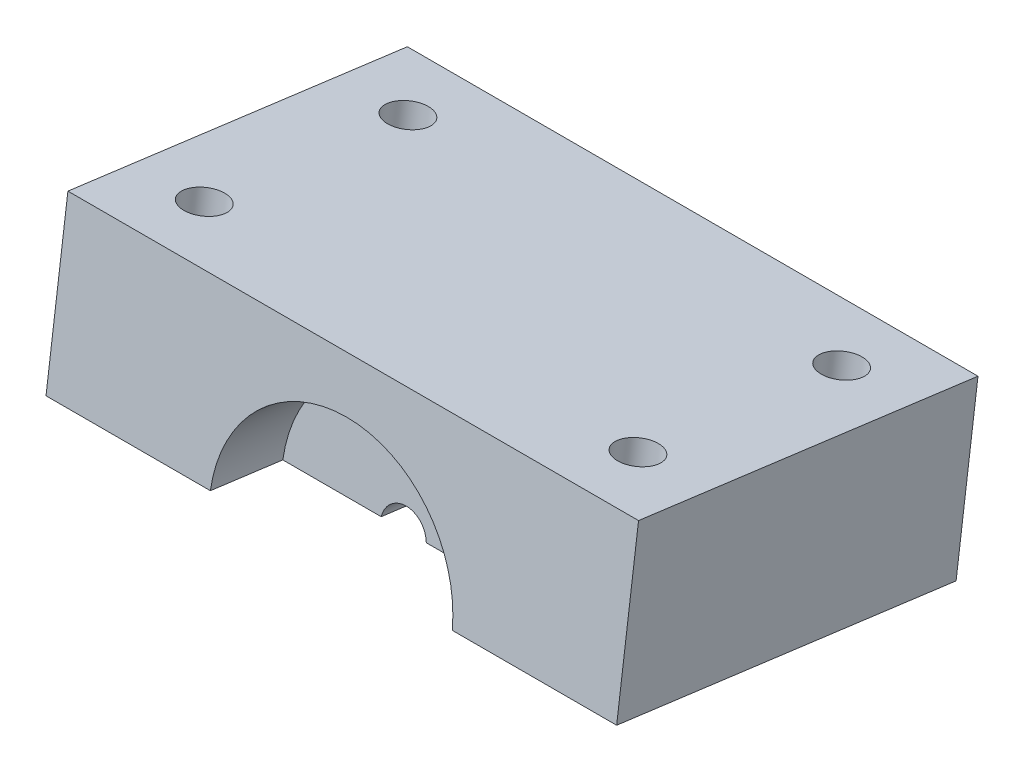
ISO-10303-21;
HEADER;
FILE_DESCRIPTION(('STEP AP214'),'2;1');
FILE_NAME('part.step','',(''),(''),'','','');
FILE_SCHEMA(('AUTOMOTIVE_DESIGN { 1 0 10303 214 1 1 1 1 }'));
ENDSEC;
DATA;
#1=APPLICATION_CONTEXT('core data for automotive mechanical design processes');
#2=APPLICATION_PROTOCOL_DEFINITION('international standard','automotive_design',2000,#1);
#3=PRODUCT_CONTEXT('',#1,'mechanical');
#4=PRODUCT('Part','Part','',(#3));
#5=PRODUCT_RELATED_PRODUCT_CATEGORY('part','',(#4));
#6=PRODUCT_DEFINITION_FORMATION('','',#4);
#7=PRODUCT_DEFINITION_CONTEXT('part definition',#1,'design');
#8=PRODUCT_DEFINITION('design','',#6,#7);
#9=PRODUCT_DEFINITION_SHAPE('','',#8);
#10=(LENGTH_UNIT() NAMED_UNIT(*) SI_UNIT(.MILLI.,.METRE.));
#11=(NAMED_UNIT(*) PLANE_ANGLE_UNIT() SI_UNIT($,.RADIAN.));
#12=(NAMED_UNIT(*) SI_UNIT($,.STERADIAN.) SOLID_ANGLE_UNIT());
#13=UNCERTAINTY_MEASURE_WITH_UNIT(LENGTH_MEASURE(1.E-05),#10,'distance_accuracy_value','');
#14=(GEOMETRIC_REPRESENTATION_CONTEXT(3) GLOBAL_UNCERTAINTY_ASSIGNED_CONTEXT((#13)) GLOBAL_UNIT_ASSIGNED_CONTEXT((#10,
#11,#12)) REPRESENTATION_CONTEXT('',''));
#15=CARTESIAN_POINT('',(0.,0.,0.));
#16=DIRECTION('',(0.,0.,1.));
#17=DIRECTION('',(1.,0.,0.));
#18=AXIS2_PLACEMENT_3D('',#15,#16,#17);
#19=CARTESIAN_POINT('',(-47.5,-10.8369896982407,-13.7027176486001));
#20=DIRECTION('',(0.,0.991444861373812,-0.130526192220038));
#21=DIRECTION('',(0.,0.130526192220039,0.991444861373812));
#22=AXIS2_PLACEMENT_3D('',#19,#20,#21);
#23=CYLINDRICAL_SURFACE('',#22,2.75);
#24=CARTESIAN_POINT('',(-47.5,-1.21430923727022,-14.9695675647722));
#25=DIRECTION('',(0.,-0.991444861373812,0.130526192220038));
#26=DIRECTION('',(0.,-0.130526192220038,-0.991444861373812));
#27=AXIS2_PLACEMENT_3D('',#24,#25,#26);
#28=CIRCLE('',#27,2.75);
#29=CARTESIAN_POINT('',(-47.5,-1.57325626587533,-17.6960409335502));
#30=VERTEX_POINT('',#29);
#31=EDGE_CURVE('E147',#30,#30,#28,.T.);
#32=ORIENTED_EDGE('',*,*,#31,.T.);
#33=EDGE_LOOP('',(#32));
#34=FACE_BOUND('',#33,.T.);
#35=CARTESIAN_POINT('',(-47.5,29.2726202499745,-18.9832479755384));
#36=DIRECTION('',(0.,0.991444861373812,-0.130526192220038));
#37=DIRECTION('',(0.,0.130526192220038,0.991444861373812));
#38=AXIS2_PLACEMENT_3D('',#35,#36,#37);
#39=CIRCLE('',#38,2.75);
#40=CARTESIAN_POINT('',(-47.5,29.6315672785796,-16.2567746067604));
#41=VERTEX_POINT('',#40);
#42=EDGE_CURVE('E41',#41,#41,#39,.F.);
#43=ORIENTED_EDGE('',*,*,#42,.F.);
#44=EDGE_LOOP('',(#43));
#45=FACE_BOUND('',#44,.T.);
#46=ADVANCED_FACE('F37',(#34,#45),#23,.F.);
#47=CARTESIAN_POINT('',(-47.5,-16.7106683481424,-58.3177364104217));
#48=DIRECTION('',(0.,0.991444861373812,-0.130526192220038));
#49=DIRECTION('',(0.,0.130526192220039,0.991444861373812));
#50=AXIS2_PLACEMENT_3D('',#47,#48,#49);
#51=CYLINDRICAL_SURFACE('',#50,2.75);
#52=CARTESIAN_POINT('',(-47.5,-7.08798788717195,-59.5845863265937));
#53=DIRECTION('',(0.,-0.991444861373812,0.130526192220038));
#54=DIRECTION('',(0.,-0.130526192220038,-0.991444861373812));
#55=AXIS2_PLACEMENT_3D('',#52,#53,#54);
#56=CIRCLE('',#55,2.75);
#57=CARTESIAN_POINT('',(-47.5,-7.44693491577706,-62.3110596953717));
#58=VERTEX_POINT('',#57);
#59=EDGE_CURVE('E151',#58,#58,#56,.T.);
#60=ORIENTED_EDGE('',*,*,#59,.T.);
#61=EDGE_LOOP('',(#60));
#62=FACE_BOUND('',#61,.T.);
#63=CARTESIAN_POINT('',(-47.5,23.3989416000728,-63.5982667373599));
#64=DIRECTION('',(0.,0.991444861373812,-0.130526192220038));
#65=DIRECTION('',(0.,0.130526192220038,0.991444861373812));
#66=AXIS2_PLACEMENT_3D('',#63,#64,#65);
#67=CIRCLE('',#66,2.75);
#68=CARTESIAN_POINT('',(-47.5,23.7578886286779,-60.8717933685819));
#69=VERTEX_POINT('',#68);
#70=EDGE_CURVE('E224',#69,#69,#67,.F.);
#71=ORIENTED_EDGE('',*,*,#70,.F.);
#72=EDGE_LOOP('',(#71));
#73=FACE_BOUND('',#72,.T.);
#74=ADVANCED_FACE('F277',(#62,#73),#51,.F.);
#75=CARTESIAN_POINT('',(47.5,-16.7106683481424,-58.3177364104217));
#76=DIRECTION('',(0.,0.991444861373812,-0.130526192220038));
#77=DIRECTION('',(0.,0.130526192220039,0.991444861373812));
#78=AXIS2_PLACEMENT_3D('',#75,#76,#77);
#79=CYLINDRICAL_SURFACE('',#78,2.75);
#80=CARTESIAN_POINT('',(47.5,-7.08798788717195,-59.5845863265938));
#81=DIRECTION('',(0.,-0.991444861373812,0.130526192220038));
#82=DIRECTION('',(0.,-0.130526192220038,-0.991444861373812));
#83=AXIS2_PLACEMENT_3D('',#80,#81,#82);
#84=CIRCLE('',#83,2.75);
#85=CARTESIAN_POINT('',(47.5,-7.44693491577706,-62.3110596953718));
#86=VERTEX_POINT('',#85);
#87=EDGE_CURVE('E203',#86,#86,#84,.T.);
#88=ORIENTED_EDGE('',*,*,#87,.T.);
#89=EDGE_LOOP('',(#88));
#90=FACE_BOUND('',#89,.T.);
#91=CARTESIAN_POINT('',(47.5,23.3989416000728,-63.5982667373599));
#92=DIRECTION('',(0.,0.991444861373812,-0.130526192220038));
#93=DIRECTION('',(0.,0.130526192220038,0.991444861373812));
#94=AXIS2_PLACEMENT_3D('',#91,#92,#93);
#95=CIRCLE('',#94,2.75);
#96=CARTESIAN_POINT('',(47.5,23.7578886286779,-60.871793368582));
#97=VERTEX_POINT('',#96);
#98=EDGE_CURVE('E221',#97,#97,#95,.F.);
#99=ORIENTED_EDGE('',*,*,#98,.F.);
#100=EDGE_LOOP('',(#99));
#101=FACE_BOUND('',#100,.T.);
#102=ADVANCED_FACE('F283',(#90,#101),#79,.F.);
#103=CARTESIAN_POINT('',(47.5,-10.8369896982407,-13.7027176486002));
#104=DIRECTION('',(0.,0.991444861373812,-0.130526192220038));
#105=DIRECTION('',(0.,0.130526192220039,0.991444861373812));
#106=AXIS2_PLACEMENT_3D('',#103,#104,#105);
#107=CYLINDRICAL_SURFACE('',#106,2.75);
#108=CARTESIAN_POINT('',(47.5,-1.21430923727022,-14.9695675647722));
#109=DIRECTION('',(0.,-0.991444861373812,0.130526192220038));
#110=DIRECTION('',(0.,-0.130526192220038,-0.991444861373812));
#111=AXIS2_PLACEMENT_3D('',#108,#109,#110);
#112=CIRCLE('',#111,2.75);
#113=CARTESIAN_POINT('',(47.5,-1.57325626587533,-17.6960409335502));
#114=VERTEX_POINT('',#113);
#115=EDGE_CURVE('E175',#114,#114,#112,.T.);
#116=ORIENTED_EDGE('',*,*,#115,.T.);
#117=EDGE_LOOP('',(#116));
#118=FACE_BOUND('',#117,.T.);
#119=CARTESIAN_POINT('',(47.5,29.2726202499745,-18.9832479755384));
#120=DIRECTION('',(0.,0.991444861373812,-0.130526192220038));
#121=DIRECTION('',(0.,0.130526192220038,0.991444861373812));
#122=AXIS2_PLACEMENT_3D('',#119,#120,#121);
#123=CIRCLE('',#122,2.75);
#124=CARTESIAN_POINT('',(47.5,29.6315672785796,-16.2567746067604));
#125=VERTEX_POINT('',#124);
#126=EDGE_CURVE('E218',#125,#125,#123,.F.);
#127=ORIENTED_EDGE('',*,*,#126,.F.);
#128=EDGE_LOOP('',(#127));
#129=FACE_BOUND('',#128,.T.);
#130=ADVANCED_FACE('F289',(#118,#129),#107,.F.);
#131=CARTESIAN_POINT('',(26.4893846663149,-9.04588077047253,-74.4562592472009));
#132=DIRECTION('',(0.,-0.991444861373812,0.130526192220038));
#133=DIRECTION('',(0.,-0.130526192220038,-0.991444861373812));
#134=AXIS2_PLACEMENT_3D('',#131,#132,#133);
#135=PLANE('',#134);
#136=DIRECTION('',(0.,0.130526192220038,0.991444861373812));
#137=VECTOR('',#136,1.);
#138=CARTESIAN_POINT('',(4.94342998332129,-10.4505542632986,-85.1258137073718));
#139=LINE('',#138,#137);
#140=CARTESIAN_POINT('',(4.94342998332129,-9.04588077047251,-74.4562592472009));
#141=VERTEX_POINT('',#140);
#142=CARTESIAN_POINT('',(4.94342998332129,-7.21851407939199,-60.5760311879676));
#143=VERTEX_POINT('',#142);
#144=EDGE_CURVE('E61',#141,#143,#139,.T.);
#145=ORIENTED_EDGE('',*,*,#144,.F.);
#146=DIRECTION('',(1.,0.,0.));
#147=VECTOR('',#146,1.);
#148=CARTESIAN_POINT('',(-62.5,-9.04588077047253,-74.4562592472009));
#149=LINE('',#148,#147);
#150=CARTESIAN_POINT('',(62.5,-9.04588077047253,-74.4562592472009));
#151=VERTEX_POINT('',#150);
#152=EDGE_CURVE('E163',#141,#151,#149,.T.);
#153=ORIENTED_EDGE('',*,*,#152,.T.);
#154=DIRECTION('',(0.,0.130526192220038,0.991444861373812));
#155=VECTOR('',#154,1.);
#156=CARTESIAN_POINT('',(62.5,-9.04588077047253,-74.4562592472009));
#157=LINE('',#156,#155);
#158=CARTESIAN_POINT('',(62.5,0.74358364603036,-0.0978946441650289));
#159=VERTEX_POINT('',#158);
#160=EDGE_CURVE('E192',#151,#159,#157,.T.);
#161=ORIENTED_EDGE('',*,*,#160,.T.);
#162=DIRECTION('',(1.,0.,0.));
#163=VECTOR('',#162,1.);
#164=CARTESIAN_POINT('',(26.4893846663149,0.743583646030359,-0.0978946441650288));
#165=LINE('',#164,#163);
#166=CARTESIAN_POINT('',(26.4893846663149,0.743583646030359,-0.0978946441650288));
#167=VERTEX_POINT('',#166);
#168=EDGE_CURVE('E184',#167,#159,#165,.T.);
#169=ORIENTED_EDGE('',*,*,#168,.F.);
#170=DIRECTION('',(0.,0.130526192220038,0.991444861373812));
#171=VECTOR('',#170,1.);
#172=CARTESIAN_POINT('',(26.4893846663149,-9.04588077047253,-74.4562592472009));
#173=LINE('',#172,#171);
#174=CARTESIAN_POINT('',(26.4893846663149,-1.34483542949026,-15.961012426146));
#175=VERTEX_POINT('',#174);
#176=EDGE_CURVE('E194',#175,#167,#173,.T.);
#177=ORIENTED_EDGE('',*,*,#176,.F.);
#178=DIRECTION('',(1.,0.,0.));
#179=VECTOR('',#178,1.);
#180=CARTESIAN_POINT('',(-26.4893846663149,-1.34483542949024,-15.961012426146));
#181=LINE('',#180,#179);
#182=CARTESIAN_POINT('',(4.94342998332129,-1.34483542949024,-15.961012426146));
#183=VERTEX_POINT('',#182);
#184=EDGE_CURVE('E148',#183,#175,#181,.T.);
#185=ORIENTED_EDGE('',*,*,#184,.F.);
#186=CARTESIAN_POINT('',(4.94342998332129,-4.6079902349912,-40.7471339604913));
#187=VERTEX_POINT('',#186);
#188=EDGE_CURVE('E128',#187,#183,#139,.T.);
#189=ORIENTED_EDGE('',*,*,#188,.F.);
#190=DIRECTION('',(1.,0.,0.));
#191=VECTOR('',#190,1.);
#192=CARTESIAN_POINT('',(26.4893846663149,-4.60799023499122,-40.7471339604913));
#193=LINE('',#192,#191);
#194=CARTESIAN_POINT('',(6.45658578507251,-4.60799023499121,-40.7471339604913));
#195=VERTEX_POINT('',#194);
#196=EDGE_CURVE('E216',#187,#195,#193,.T.);
#197=ORIENTED_EDGE('',*,*,#196,.T.);
#198=DIRECTION('',(0.,0.130526192220038,0.991444861373812));
#199=VECTOR('',#198,1.);
#200=CARTESIAN_POINT('',(6.45658578507251,0.74358364603036,-0.0978946441650214));
#201=LINE('',#200,#199);
#202=CARTESIAN_POINT('',(6.45658578507247,-7.21851407939199,-60.5760311879676));
#203=VERTEX_POINT('',#202);
#204=EDGE_CURVE('E213',#195,#203,#201,.F.);
#205=ORIENTED_EDGE('',*,*,#204,.T.);
#206=DIRECTION('',(-1.,0.,0.));
#207=VECTOR('',#206,1.);
#208=CARTESIAN_POINT('',(26.4893846663149,-7.21851407939199,-60.5760311879676));
#209=LINE('',#208,#207);
#210=EDGE_CURVE('E208',#203,#143,#209,.T.);
#211=ORIENTED_EDGE('',*,*,#210,.T.);
#212=EDGE_LOOP('',(#145,#153,#161,#169,#177,#185,#189,#197,#205,#211));
#213=FACE_BOUND('',#212,.T.);
#214=ORIENTED_EDGE('',*,*,#87,.F.);
#215=EDGE_LOOP('',(#214));
#216=FACE_BOUND('',#215,.T.);
#217=ORIENTED_EDGE('',*,*,#115,.F.);
#218=EDGE_LOOP('',(#217));
#219=FACE_BOUND('',#218,.T.);
#220=ADVANCED_FACE('F264',(#213,#216,#219),#135,.T.);
#221=DIRECTION('',(0.,0.130526192220038,0.991444861373812));
#222=VECTOR('',#221,1.);
#223=CARTESIAN_POINT('',(-4.94342998332129,-10.4505542632986,-85.1258137073718));
#224=LINE('',#223,#222);
#225=CARTESIAN_POINT('',(-4.94342998332129,-4.60799023499122,-40.7471339604913));
#226=VERTEX_POINT('',#225);
#227=CARTESIAN_POINT('',(-4.94342998332129,-1.34483542949024,-15.961012426146));
#228=VERTEX_POINT('',#227);
#229=EDGE_CURVE('E54',#226,#228,#224,.T.);
#230=ORIENTED_EDGE('',*,*,#229,.T.);
#231=CARTESIAN_POINT('',(-26.4893846663149,-1.34483542949024,-15.961012426146));
#232=VERTEX_POINT('',#231);
#233=EDGE_CURVE('E139',#232,#228,#181,.T.);
#234=ORIENTED_EDGE('',*,*,#233,.F.);
#235=DIRECTION('',(0.,0.130526192220038,0.991444861373812));
#236=VECTOR('',#235,1.);
#237=CARTESIAN_POINT('',(-26.4893846663149,-9.04588077047251,-74.4562592472009));
#238=LINE('',#237,#236);
#239=CARTESIAN_POINT('',(-26.4893846663149,0.743583646030378,-0.0978946441650313));
#240=VERTEX_POINT('',#239);
#241=EDGE_CURVE('E196',#232,#240,#238,.T.);
#242=ORIENTED_EDGE('',*,*,#241,.T.);
#243=DIRECTION('',(1.,0.,0.));
#244=VECTOR('',#243,1.);
#245=CARTESIAN_POINT('',(-62.5,0.74358364603036,-0.0978946441650289));
#246=LINE('',#245,#244);
#247=CARTESIAN_POINT('',(-62.5,0.74358364603036,-0.0978946441650289));
#248=VERTEX_POINT('',#247);
#249=EDGE_CURVE('E178',#248,#240,#246,.T.);
#250=ORIENTED_EDGE('',*,*,#249,.F.);
#251=DIRECTION('',(0.,0.130526192220038,0.991444861373812));
#252=VECTOR('',#251,1.);
#253=CARTESIAN_POINT('',(-62.5,-9.04588077047253,-74.4562592472009));
#254=LINE('',#253,#252);
#255=CARTESIAN_POINT('',(-62.5,-9.04588077047253,-74.4562592472009));
#256=VERTEX_POINT('',#255);
#257=EDGE_CURVE('E198',#256,#248,#254,.T.);
#258=ORIENTED_EDGE('',*,*,#257,.F.);
#259=CARTESIAN_POINT('',(-4.94342998332129,-9.04588077047251,-74.4562592472009));
#260=VERTEX_POINT('',#259);
#261=EDGE_CURVE('E164',#256,#260,#149,.T.);
#262=ORIENTED_EDGE('',*,*,#261,.T.);
#263=CARTESIAN_POINT('',(-4.94342998332129,-7.21851407939197,-60.5760311879676));
#264=VERTEX_POINT('',#263);
#265=EDGE_CURVE('E141',#260,#264,#224,.T.);
#266=ORIENTED_EDGE('',*,*,#265,.T.);
#267=CARTESIAN_POINT('',(-6.45658578507247,-7.21851407939199,-60.5760311879676));
#268=VERTEX_POINT('',#267);
#269=EDGE_CURVE('E191',#264,#268,#209,.T.);
#270=ORIENTED_EDGE('',*,*,#269,.T.);
#271=DIRECTION('',(0.,0.130526192220038,0.991444861373812));
#272=VECTOR('',#271,1.);
#273=CARTESIAN_POINT('',(-6.45658578507251,0.74358364603036,-0.0978946441650213));
#274=LINE('',#273,#272);
#275=CARTESIAN_POINT('',(-6.45658578507251,-4.60799023499121,-40.7471339604913));
#276=VERTEX_POINT('',#275);
#277=EDGE_CURVE('E211',#268,#276,#274,.T.);
#278=ORIENTED_EDGE('',*,*,#277,.T.);
#279=EDGE_CURVE('E46',#276,#226,#193,.T.);
#280=ORIENTED_EDGE('',*,*,#279,.T.);
#281=EDGE_LOOP('',(#230,#234,#242,#250,#258,#262,#266,#270,#278,#280));
#282=FACE_BOUND('',#281,.T.);
#283=ORIENTED_EDGE('',*,*,#59,.F.);
#284=EDGE_LOOP('',(#283));
#285=FACE_BOUND('',#284,.T.);
#286=ORIENTED_EDGE('',*,*,#31,.F.);
#287=EDGE_LOOP('',(#286));
#288=FACE_BOUND('',#287,.T.);
#289=ADVANCED_FACE('F137',(#282,#285,#288),#135,.T.);
#290=CARTESIAN_POINT('',(62.5,27.3897178850151,-79.2530968112873));
#291=DIRECTION('',(0.,0.991444861373812,-0.130526192220038));
#292=DIRECTION('',(0.,0.130526192220038,0.991444861373812));
#293=AXIS2_PLACEMENT_3D('',#290,#291,#292);
#294=PLANE('',#293);
#295=CARTESIAN_POINT('',(47.5,29.3476107683156,-64.3814238906802));
#296=DIRECTION('',(0.,0.991444861373812,-0.130526192220038));
#297=DIRECTION('',(0.,0.130526192220038,0.991444861373812));
#298=AXIS2_PLACEMENT_3D('',#295,#296,#297);
#299=CIRCLE('',#298,4.5);
#300=CARTESIAN_POINT('',(47.5,29.9349786333058,-59.919922014498));
#301=VERTEX_POINT('',#300);
#302=EDGE_CURVE('E399',#301,#301,#299,.T.);
#303=ORIENTED_EDGE('',*,*,#302,.F.);
#304=EDGE_LOOP('',(#303));
#305=FACE_BOUND('',#304,.T.);
#306=CARTESIAN_POINT('',(-47.5,35.2212894182174,-19.7664051288586));
#307=DIRECTION('',(0.,0.991444861373812,-0.130526192220038));
#308=DIRECTION('',(0.,0.130526192220038,0.991444861373812));
#309=AXIS2_PLACEMENT_3D('',#306,#307,#308);
#310=CIRCLE('',#309,4.5);
#311=CARTESIAN_POINT('',(-47.5,35.8086572832076,-15.3049032526765));
#312=VERTEX_POINT('',#311);
#313=EDGE_CURVE('E395',#312,#312,#310,.T.);
#314=ORIENTED_EDGE('',*,*,#313,.F.);
#315=EDGE_LOOP('',(#314));
#316=FACE_BOUND('',#315,.T.);
#317=CARTESIAN_POINT('',(-47.5,29.3476107683156,-64.3814238906802));
#318=DIRECTION('',(0.,0.991444861373812,-0.130526192220038));
#319=DIRECTION('',(0.,0.130526192220038,0.991444861373812));
#320=AXIS2_PLACEMENT_3D('',#317,#318,#319);
#321=CIRCLE('',#320,4.5);
#322=CARTESIAN_POINT('',(-47.5,29.9349786333058,-59.919922014498));
#323=VERTEX_POINT('',#322);
#324=EDGE_CURVE('E390',#323,#323,#321,.T.);
#325=ORIENTED_EDGE('',*,*,#324,.F.);
#326=EDGE_LOOP('',(#325));
#327=FACE_BOUND('',#326,.T.);
#328=CARTESIAN_POINT('',(47.5,35.2212894182174,-19.7664051288587));
#329=DIRECTION('',(0.,0.991444861373812,-0.130526192220038));
#330=DIRECTION('',(0.,0.130526192220038,0.991444861373812));
#331=AXIS2_PLACEMENT_3D('',#328,#329,#330);
#332=CIRCLE('',#331,4.5);
#333=CARTESIAN_POINT('',(47.5,35.8086572832076,-15.3049032526765));
#334=VERTEX_POINT('',#333);
#335=EDGE_CURVE('E402',#334,#334,#332,.T.);
#336=ORIENTED_EDGE('',*,*,#335,.F.);
#337=EDGE_LOOP('',(#336));
#338=FACE_BOUND('',#337,.T.);
#339=DIRECTION('',(-1.,0.,0.));
#340=VECTOR('',#339,1.);
#341=CARTESIAN_POINT('',(62.5,37.179182301518,-4.89473220825144));
#342=LINE('',#341,#340);
#343=CARTESIAN_POINT('',(62.5,37.179182301518,-4.89473220825144));
#344=VERTEX_POINT('',#343);
#345=CARTESIAN_POINT('',(-62.5,37.179182301518,-4.89473220825144));
#346=VERTEX_POINT('',#345);
#347=EDGE_CURVE('E171',#344,#346,#342,.T.);
#348=ORIENTED_EDGE('',*,*,#347,.F.);
#349=DIRECTION('',(0.,0.130526192220038,0.991444861373812));
#350=VECTOR('',#349,1.);
#351=CARTESIAN_POINT('',(62.5,27.3897178850151,-79.2530968112873));
#352=LINE('',#351,#350);
#353=CARTESIAN_POINT('',(62.5,27.3897178850151,-79.2530968112873));
#354=VERTEX_POINT('',#353);
#355=EDGE_CURVE('E189',#354,#344,#352,.T.);
#356=ORIENTED_EDGE('',*,*,#355,.F.);
#357=DIRECTION('',(-1.,0.,0.));
#358=VECTOR('',#357,1.);
#359=CARTESIAN_POINT('',(62.5,27.3897178850151,-79.2530968112873));
#360=LINE('',#359,#358);
#361=CARTESIAN_POINT('',(-62.5,27.3897178850151,-79.2530968112873));
#362=VERTEX_POINT('',#361);
#363=EDGE_CURVE('E156',#354,#362,#360,.T.);
#364=ORIENTED_EDGE('',*,*,#363,.T.);
#365=DIRECTION('',(0.,0.130526192220038,0.991444861373812));
#366=VECTOR('',#365,1.);
#367=CARTESIAN_POINT('',(-62.5,27.3897178850151,-79.2530968112873));
#368=LINE('',#367,#366);
#369=EDGE_CURVE('E170',#362,#346,#368,.T.);
#370=ORIENTED_EDGE('',*,*,#369,.T.);
#371=EDGE_LOOP('',(#348,#356,#364,#370));
#372=FACE_BOUND('',#371,.T.);
#373=ADVANCED_FACE('F39',(#305,#316,#327,#338,#372),#294,.T.);
#374=CARTESIAN_POINT('',(62.5,-9.04588077047253,-74.4562592472009));
#375=DIRECTION('',(1.,0.,0.));
#376=DIRECTION('',(0.,1.,0.));
#377=AXIS2_PLACEMENT_3D('',#374,#375,#376);
#378=PLANE('',#377);
#379=DIRECTION('',(0.,0.991444861373812,-0.130526192220038));
#380=VECTOR('',#379,1.);
#381=CARTESIAN_POINT('',(62.5,0.74358364603036,-0.0978946441650289));
#382=LINE('',#381,#380);
#383=EDGE_CURVE('E160',#159,#344,#382,.T.);
#384=ORIENTED_EDGE('',*,*,#383,.F.);
#385=ORIENTED_EDGE('',*,*,#160,.F.);
#386=DIRECTION('',(0.,0.991444861373812,-0.130526192220038));
#387=VECTOR('',#386,1.);
#388=CARTESIAN_POINT('',(62.5,-9.04588077047253,-74.4562592472009));
#389=LINE('',#388,#387);
#390=EDGE_CURVE('E167',#151,#354,#389,.T.);
#391=ORIENTED_EDGE('',*,*,#390,.T.);
#392=ORIENTED_EDGE('',*,*,#355,.T.);
#393=EDGE_LOOP('',(#384,#385,#391,#392));
#394=FACE_BOUND('',#393,.T.);
#395=ADVANCED_FACE('F298',(#394),#378,.T.);
#396=CARTESIAN_POINT('',(0.,-9.78946441650289,-74.3583646030359));
#397=DIRECTION('',(0.,0.130526192220038,0.991444861373812));
#398=DIRECTION('',(0.,-0.991444861373812,0.130526192220038));
#399=AXIS2_PLACEMENT_3D('',#396,#397,#398);
#400=CYLINDRICAL_SURFACE('',#399,26.5);
#401=CARTESIAN_POINT('',(0.,-2.08841907552062,-15.863117781981));
#402=DIRECTION('',(0.,0.130526192220038,0.991444861373812));
#403=DIRECTION('',(0.,-0.991444861373812,0.130526192220038));
#404=AXIS2_PLACEMENT_3D('',#401,#402,#403);
#405=CIRCLE('',#404,26.5);
#406=EDGE_CURVE('E146',#175,#232,#405,.T.);
#407=ORIENTED_EDGE('',*,*,#406,.F.);
#408=ORIENTED_EDGE('',*,*,#176,.T.);
#409=CARTESIAN_POINT('',(0.,0.,0.));
#410=DIRECTION('',(0.,-0.130526192220038,-0.991444861373812));
#411=DIRECTION('',(0.,-0.991444861373812,0.130526192220038));
#412=AXIS2_PLACEMENT_3D('',#409,#410,#411);
#413=CIRCLE('',#412,26.5);
#414=EDGE_CURVE('E181',#240,#167,#413,.T.);
#415=ORIENTED_EDGE('',*,*,#414,.F.);
#416=ORIENTED_EDGE('',*,*,#241,.F.);
#417=EDGE_LOOP('',(#407,#408,#415,#416));
#418=FACE_BOUND('',#417,.T.);
#419=ADVANCED_FACE('F301',(#418),#400,.F.);
#420=CARTESIAN_POINT('',(-62.5,27.3897178850151,-79.2530968112873));
#421=DIRECTION('',(-1.,0.,0.));
#422=DIRECTION('',(0.,-1.,0.));
#423=AXIS2_PLACEMENT_3D('',#420,#421,#422);
#424=PLANE('',#423);
#425=DIRECTION('',(0.,-0.991444861373812,0.130526192220038));
#426=VECTOR('',#425,1.);
#427=CARTESIAN_POINT('',(-62.5,37.179182301518,-4.89473220825144));
#428=LINE('',#427,#426);
#429=EDGE_CURVE('E174',#346,#248,#428,.T.);
#430=ORIENTED_EDGE('',*,*,#429,.F.);
#431=ORIENTED_EDGE('',*,*,#369,.F.);
#432=DIRECTION('',(0.,-0.991444861373812,0.130526192220038));
#433=VECTOR('',#432,1.);
#434=CARTESIAN_POINT('',(-62.5,27.3897178850151,-79.2530968112873));
#435=LINE('',#434,#433);
#436=EDGE_CURVE('E159',#362,#256,#435,.T.);
#437=ORIENTED_EDGE('',*,*,#436,.T.);
#438=ORIENTED_EDGE('',*,*,#257,.T.);
#439=EDGE_LOOP('',(#430,#431,#437,#438));
#440=FACE_BOUND('',#439,.T.);
#441=ADVANCED_FACE('F293',(#440),#424,.T.);
#442=CARTESIAN_POINT('',(0.,-9.78946441650289,-74.3583646030359));
#443=DIRECTION('',(0.,0.130526192220038,0.991444861373812));
#444=DIRECTION('',(0.,-0.991444861373812,0.130526192220038));
#445=AXIS2_PLACEMENT_3D('',#442,#443,#444);
#446=PLANE('',#445);
#447=CARTESIAN_POINT('',(20.,10.0394328109734,-76.9688884474367));
#448=DIRECTION('',(0.,-0.130526192220038,-0.991444861373812));
#449=DIRECTION('',(0.,0.991444861373812,-0.130526192220038));
#450=AXIS2_PLACEMENT_3D('',#447,#448,#449);
#451=CIRCLE('',#450,2.00000000000001);
#452=CARTESIAN_POINT('',(20.,12.022322533721,-77.2299408318768));
#453=VERTEX_POINT('',#452);
#454=EDGE_CURVE('E238',#453,#453,#451,.T.);
#455=ORIENTED_EDGE('',*,*,#454,.F.);
#456=EDGE_LOOP('',(#455));
#457=FACE_BOUND('',#456,.T.);
#458=CARTESIAN_POINT('',(-20.,10.0394328109734,-76.9688884474367));
#459=DIRECTION('',(0.,-0.130526192220038,-0.991444861373812));
#460=DIRECTION('',(0.,0.991444861373812,-0.130526192220038));
#461=AXIS2_PLACEMENT_3D('',#458,#459,#460);
#462=CIRCLE('',#461,2.);
#463=CARTESIAN_POINT('',(-20.,12.022322533721,-77.2299408318768));
#464=VERTEX_POINT('',#463);
#465=EDGE_CURVE('E233',#464,#464,#462,.T.);
#466=ORIENTED_EDGE('',*,*,#465,.F.);
#467=EDGE_LOOP('',(#466));
#468=FACE_BOUND('',#467,.T.);
#469=ORIENTED_EDGE('',*,*,#152,.F.);
#470=CARTESIAN_POINT('',(0.,-9.78946441650289,-74.3583646030359));
#471=DIRECTION('',(0.,0.130526192220038,0.991444861373812));
#472=DIRECTION('',(0.,-0.991444861373812,0.130526192220038));
#473=AXIS2_PLACEMENT_3D('',#470,#471,#472);
#474=CIRCLE('',#473,5.);
#475=EDGE_CURVE('E242',#260,#141,#474,.F.);
#476=ORIENTED_EDGE('',*,*,#475,.F.);
#477=ORIENTED_EDGE('',*,*,#261,.F.);
#478=ORIENTED_EDGE('',*,*,#436,.F.);
#479=ORIENTED_EDGE('',*,*,#363,.F.);
#480=ORIENTED_EDGE('',*,*,#390,.F.);
#481=EDGE_LOOP('',(#469,#476,#477,#478,#479,#480));
#482=FACE_BOUND('',#481,.T.);
#483=ADVANCED_FACE('F290',(#457,#468,#482),#446,.F.);
#484=CARTESIAN_POINT('',(0.,0.,0.));
#485=DIRECTION('',(0.,0.130526192220038,0.991444861373812));
#486=DIRECTION('',(0.,-0.991444861373812,0.130526192220038));
#487=AXIS2_PLACEMENT_3D('',#484,#485,#486);
#488=PLANE('',#487);
#489=ORIENTED_EDGE('',*,*,#347,.T.);
#490=ORIENTED_EDGE('',*,*,#429,.T.);
#491=ORIENTED_EDGE('',*,*,#249,.T.);
#492=ORIENTED_EDGE('',*,*,#414,.T.);
#493=ORIENTED_EDGE('',*,*,#168,.T.);
#494=ORIENTED_EDGE('',*,*,#383,.T.);
#495=EDGE_LOOP('',(#489,#490,#491,#492,#493,#494));
#496=FACE_BOUND('',#495,.T.);
#497=ADVANCED_FACE('F274',(#496),#488,.T.);
#498=CARTESIAN_POINT('',(0.,-2.08841907552062,-15.863117781981));
#499=DIRECTION('',(0.,0.130526192220038,0.991444861373812));
#500=DIRECTION('',(0.,-0.991444861373812,0.130526192220038));
#501=AXIS2_PLACEMENT_3D('',#498,#499,#500);
#502=PLANE('',#501);
#503=CARTESIAN_POINT('',(0.,-2.08841907552062,-15.863117781981));
#504=DIRECTION('',(0.,0.130526192220038,0.991444861373812));
#505=DIRECTION('',(0.,-0.991444861373812,0.130526192220038));
#506=AXIS2_PLACEMENT_3D('',#503,#504,#505);
#507=CIRCLE('',#506,5.);
#508=EDGE_CURVE('E125',#183,#228,#507,.T.);
#509=ORIENTED_EDGE('',*,*,#508,.F.);
#510=ORIENTED_EDGE('',*,*,#184,.T.);
#511=ORIENTED_EDGE('',*,*,#406,.T.);
#512=ORIENTED_EDGE('',*,*,#233,.T.);
#513=EDGE_LOOP('',(#509,#510,#511,#512));
#514=FACE_BOUND('',#513,.T.);
#515=ADVANCED_FACE('F144',(#514),#502,.T.);
#516=CARTESIAN_POINT('',(0.,-5.35157388102151,-40.6492393163263));
#517=DIRECTION('',(0.,-0.130526192220038,-0.991444861373812));
#518=DIRECTION('',(0.,0.991444861373812,-0.130526192220038));
#519=AXIS2_PLACEMENT_3D('',#516,#517,#518);
#520=PLANE('',#519);
#521=CARTESIAN_POINT('',(0.,-5.35157388102158,-40.6492393163263));
#522=DIRECTION('',(0.,-0.130526192220038,-0.991444861373812));
#523=DIRECTION('',(0.,0.991444861373812,-0.130526192220038));
#524=AXIS2_PLACEMENT_3D('',#521,#522,#523);
#525=CIRCLE('',#524,5.);
#526=EDGE_CURVE('E243',#226,#187,#525,.T.);
#527=ORIENTED_EDGE('',*,*,#526,.F.);
#528=ORIENTED_EDGE('',*,*,#279,.F.);
#529=CARTESIAN_POINT('',(0.,-5.35157388102156,-40.6492393163263));
#530=DIRECTION('',(0.,0.130526192220038,0.991444861373812));
#531=DIRECTION('',(0.,-0.991444861373812,0.130526192220038));
#532=AXIS2_PLACEMENT_3D('',#529,#530,#531);
#533=CIRCLE('',#532,6.50000000000006);
#534=EDGE_CURVE('E250',#195,#276,#533,.T.);
#535=ORIENTED_EDGE('',*,*,#534,.F.);
#536=ORIENTED_EDGE('',*,*,#196,.F.);
#537=EDGE_LOOP('',(#527,#528,#535,#536));
#538=FACE_BOUND('',#537,.T.);
#539=ADVANCED_FACE('F266',(#538),#520,.T.);
#540=CARTESIAN_POINT('',(0.,0.,0.));
#541=DIRECTION('',(0.,0.130526192220038,0.991444861373812));
#542=DIRECTION('',(0.,-0.991444861373812,0.130526192220038));
#543=AXIS2_PLACEMENT_3D('',#540,#541,#542);
#544=CYLINDRICAL_SURFACE('',#543,6.50000000000003);
#545=ORIENTED_EDGE('',*,*,#534,.T.);
#546=ORIENTED_EDGE('',*,*,#277,.F.);
#547=CARTESIAN_POINT('',(0.,-7.96209772542233,-60.4781365438025));
#548=DIRECTION('',(0.,0.130526192220038,0.991444861373812));
#549=DIRECTION('',(0.,-0.991444861373812,0.130526192220038));
#550=AXIS2_PLACEMENT_3D('',#547,#548,#549);
#551=CIRCLE('',#550,6.49999999999999);
#552=EDGE_CURVE('E248',#203,#268,#551,.T.);
#553=ORIENTED_EDGE('',*,*,#552,.F.);
#554=ORIENTED_EDGE('',*,*,#204,.F.);
#555=EDGE_LOOP('',(#545,#546,#553,#554));
#556=FACE_BOUND('',#555,.T.);
#557=ADVANCED_FACE('F256',(#556),#544,.F.);
#558=CARTESIAN_POINT('',(0.,-1.51770612649256,-61.3265567932328));
#559=DIRECTION('',(0.,0.130526192220038,0.991444861373812));
#560=DIRECTION('',(0.,-0.991444861373812,0.130526192220038));
#561=AXIS2_PLACEMENT_3D('',#558,#559,#560);
#562=PLANE('',#561);
#563=CARTESIAN_POINT('',(0.,-7.96209772542235,-60.4781365438025));
#564=DIRECTION('',(0.,0.130526192220038,0.991444861373812));
#565=DIRECTION('',(0.,-0.991444861373812,0.130526192220038));
#566=AXIS2_PLACEMENT_3D('',#563,#564,#565);
#567=CIRCLE('',#566,5.);
#568=EDGE_CURVE('E11',#143,#264,#567,.T.);
#569=ORIENTED_EDGE('',*,*,#568,.F.);
#570=ORIENTED_EDGE('',*,*,#210,.F.);
#571=ORIENTED_EDGE('',*,*,#552,.T.);
#572=ORIENTED_EDGE('',*,*,#269,.F.);
#573=EDGE_LOOP('',(#569,#570,#571,#572));
#574=FACE_BOUND('',#573,.T.);
#575=ADVANCED_FACE('F262',(#574),#562,.T.);
#576=CARTESIAN_POINT('',(0.,-11.194137909329,-85.0279190632068));
#577=DIRECTION('',(0.,0.130526192220038,0.991444861373812));
#578=DIRECTION('',(0.,-0.991444861373812,0.130526192220039));
#579=AXIS2_PLACEMENT_3D('',#576,#577,#578);
#580=CYLINDRICAL_SURFACE('',#579,5.);
#581=ORIENTED_EDGE('',*,*,#568,.T.);
#582=ORIENTED_EDGE('',*,*,#265,.F.);
#583=ORIENTED_EDGE('',*,*,#475,.T.);
#584=ORIENTED_EDGE('',*,*,#144,.T.);
#585=EDGE_LOOP('',(#581,#582,#583,#584));
#586=FACE_BOUND('',#585,.T.);
#587=ADVANCED_FACE('F327',(#586),#580,.F.);
#588=ORIENTED_EDGE('',*,*,#526,.T.);
#589=ORIENTED_EDGE('',*,*,#188,.T.);
#590=ORIENTED_EDGE('',*,*,#508,.T.);
#591=ORIENTED_EDGE('',*,*,#229,.F.);
#592=EDGE_LOOP('',(#588,#589,#590,#591));
#593=FACE_BOUND('',#592,.T.);
#594=ADVANCED_FACE('F126',(#593),#580,.F.);
#595=CARTESIAN_POINT('',(-20.,13.3025876164743,-52.1827669130914));
#596=DIRECTION('',(0.,-0.130526192220038,-0.991444861373812));
#597=DIRECTION('',(0.,0.991444861373812,-0.130526192220038));
#598=AXIS2_PLACEMENT_3D('',#595,#596,#597);
#599=CYLINDRICAL_SURFACE('',#598,2.);
#600=CARTESIAN_POINT('',(-20.,13.3025876164743,-52.1827669130914));
#601=DIRECTION('',(0.,-0.130526192220038,-0.991444861373812));
#602=DIRECTION('',(0.,0.991444861373812,-0.130526192220038));
#603=AXIS2_PLACEMENT_3D('',#600,#601,#602);
#604=CIRCLE('',#603,2.);
#605=CARTESIAN_POINT('',(-20.,15.2854773392219,-52.4438192975315));
#606=VERTEX_POINT('',#605);
#607=EDGE_CURVE('E229',#606,#606,#604,.T.);
#608=ORIENTED_EDGE('',*,*,#607,.F.);
#609=EDGE_LOOP('',(#608));
#610=FACE_BOUND('',#609,.T.);
#611=ORIENTED_EDGE('',*,*,#465,.T.);
#612=EDGE_LOOP('',(#611));
#613=FACE_BOUND('',#612,.T.);
#614=ADVANCED_FACE('F334',(#610,#613),#599,.F.);
#615=CARTESIAN_POINT('',(-20.,13.3025876164743,-52.1827669130914));
#616=DIRECTION('',(0.,-0.130526192220038,-0.991444861373812));
#617=DIRECTION('',(0.,0.991444861373812,-0.130526192220038));
#618=AXIS2_PLACEMENT_3D('',#615,#616,#617);
#619=PLANE('',#618);
#620=ORIENTED_EDGE('',*,*,#607,.T.);
#621=EDGE_LOOP('',(#620));
#622=FACE_BOUND('',#621,.T.);
#623=ADVANCED_FACE('F337',(#622),#619,.T.);
#624=CARTESIAN_POINT('',(20.,13.3025876164743,-52.1827669130914));
#625=DIRECTION('',(0.,-0.130526192220038,-0.991444861373812));
#626=DIRECTION('',(0.,0.991444861373812,-0.130526192220038));
#627=AXIS2_PLACEMENT_3D('',#624,#625,#626);
#628=CYLINDRICAL_SURFACE('',#627,2.00000000000001);
#629=CARTESIAN_POINT('',(20.,13.3025876164743,-52.1827669130914));
#630=DIRECTION('',(0.,-0.130526192220038,-0.991444861373812));
#631=DIRECTION('',(0.,0.991444861373812,-0.130526192220038));
#632=AXIS2_PLACEMENT_3D('',#629,#630,#631);
#633=CIRCLE('',#632,2.00000000000001);
#634=CARTESIAN_POINT('',(20.,15.285477339222,-52.4438192975315));
#635=VERTEX_POINT('',#634);
#636=EDGE_CURVE('E132',#635,#635,#633,.T.);
#637=ORIENTED_EDGE('',*,*,#636,.F.);
#638=EDGE_LOOP('',(#637));
#639=FACE_BOUND('',#638,.T.);
#640=ORIENTED_EDGE('',*,*,#454,.T.);
#641=EDGE_LOOP('',(#640));
#642=FACE_BOUND('',#641,.T.);
#643=ADVANCED_FACE('F340',(#639,#642),#628,.F.);
#644=CARTESIAN_POINT('',(20.,13.3025876164743,-52.1827669130914));
#645=DIRECTION('',(0.,-0.130526192220038,-0.991444861373812));
#646=DIRECTION('',(0.,0.991444861373812,-0.130526192220038));
#647=AXIS2_PLACEMENT_3D('',#644,#645,#646);
#648=PLANE('',#647);
#649=ORIENTED_EDGE('',*,*,#636,.T.);
#650=EDGE_LOOP('',(#649));
#651=FACE_BOUND('',#650,.T.);
#652=ADVANCED_FACE('F346',(#651),#648,.T.);
#653=CARTESIAN_POINT('',(47.5,29.2726202499745,-18.9832479755384));
#654=DIRECTION('',(0.,0.991444861373812,-0.130526192220038));
#655=DIRECTION('',(0.,0.130526192220038,0.991444861373812));
#656=AXIS2_PLACEMENT_3D('',#653,#654,#655);
#657=PLANE('',#656);
#658=CARTESIAN_POINT('',(47.5,29.2726202499745,-18.9832479755384));
#659=DIRECTION('',(0.,0.991444861373812,-0.130526192220038));
#660=DIRECTION('',(0.,0.130526192220038,0.991444861373812));
#661=AXIS2_PLACEMENT_3D('',#658,#659,#660);
#662=CIRCLE('',#661,4.5);
#663=CARTESIAN_POINT('',(47.5,29.8599881149647,-14.5217460993563));
#664=VERTEX_POINT('',#663);
#665=EDGE_CURVE('E222',#664,#664,#662,.T.);
#666=ORIENTED_EDGE('',*,*,#665,.T.);
#667=EDGE_LOOP('',(#666));
#668=FACE_BOUND('',#667,.T.);
#669=ORIENTED_EDGE('',*,*,#126,.T.);
#670=EDGE_LOOP('',(#669));
#671=FACE_BOUND('',#670,.T.);
#672=ADVANCED_FACE('F350',(#668,#671),#657,.T.);
#673=CARTESIAN_POINT('',(47.5,29.2726202499745,-18.9832479755384));
#674=DIRECTION('',(0.,0.991444861373812,-0.130526192220038));
#675=DIRECTION('',(0.,0.130526192220039,0.991444861373812));
#676=AXIS2_PLACEMENT_3D('',#673,#674,#675);
#677=CYLINDRICAL_SURFACE('',#676,4.5);
#678=ORIENTED_EDGE('',*,*,#665,.F.);
#679=EDGE_LOOP('',(#678));
#680=FACE_BOUND('',#679,.T.);
#681=ORIENTED_EDGE('',*,*,#335,.T.);
#682=EDGE_LOOP('',(#681));
#683=FACE_BOUND('',#682,.T.);
#684=ADVANCED_FACE('F352',(#680,#683),#677,.F.);
#685=CARTESIAN_POINT('',(47.5,23.3989416000728,-63.59826673736));
#686=DIRECTION('',(0.,0.991444861373812,-0.130526192220038));
#687=DIRECTION('',(0.,0.130526192220038,0.991444861373812));
#688=AXIS2_PLACEMENT_3D('',#685,#686,#687);
#689=PLANE('',#688);
#690=CARTESIAN_POINT('',(47.5,23.3989416000728,-63.59826673736));
#691=DIRECTION('',(0.,0.991444861373812,-0.130526192220038));
#692=DIRECTION('',(0.,0.130526192220038,0.991444861373812));
#693=AXIS2_PLACEMENT_3D('',#690,#691,#692);
#694=CIRCLE('',#693,4.5);
#695=CARTESIAN_POINT('',(47.5,23.9863094650629,-59.1367648611778));
#696=VERTEX_POINT('',#695);
#697=EDGE_CURVE('E403',#696,#696,#694,.T.);
#698=ORIENTED_EDGE('',*,*,#697,.T.);
#699=EDGE_LOOP('',(#698));
#700=FACE_BOUND('',#699,.T.);
#701=ORIENTED_EDGE('',*,*,#98,.T.);
#702=EDGE_LOOP('',(#701));
#703=FACE_BOUND('',#702,.T.);
#704=ADVANCED_FACE('F355',(#700,#703),#689,.T.);
#705=CARTESIAN_POINT('',(47.5,23.3989416000728,-63.59826673736));
#706=DIRECTION('',(0.,0.991444861373812,-0.130526192220038));
#707=DIRECTION('',(0.,0.130526192220039,0.991444861373812));
#708=AXIS2_PLACEMENT_3D('',#705,#706,#707);
#709=CYLINDRICAL_SURFACE('',#708,4.5);
#710=ORIENTED_EDGE('',*,*,#697,.F.);
#711=EDGE_LOOP('',(#710));
#712=FACE_BOUND('',#711,.T.);
#713=ORIENTED_EDGE('',*,*,#302,.T.);
#714=EDGE_LOOP('',(#713));
#715=FACE_BOUND('',#714,.T.);
#716=ADVANCED_FACE('F371',(#712,#715),#709,.F.);
#717=CARTESIAN_POINT('',(-47.5,23.3989416000728,-63.5982667373599));
#718=DIRECTION('',(0.,0.991444861373812,-0.130526192220038));
#719=DIRECTION('',(0.,0.130526192220038,0.991444861373812));
#720=AXIS2_PLACEMENT_3D('',#717,#718,#719);
#721=PLANE('',#720);
#722=CARTESIAN_POINT('',(-47.5,23.3989416000728,-63.5982667373599));
#723=DIRECTION('',(0.,0.991444861373812,-0.130526192220038));
#724=DIRECTION('',(0.,0.130526192220038,0.991444861373812));
#725=AXIS2_PLACEMENT_3D('',#722,#723,#724);
#726=CIRCLE('',#725,4.5);
#727=CARTESIAN_POINT('',(-47.5,23.9863094650629,-59.1367648611778));
#728=VERTEX_POINT('',#727);
#729=EDGE_CURVE('E387',#728,#728,#726,.T.);
#730=ORIENTED_EDGE('',*,*,#729,.T.);
#731=EDGE_LOOP('',(#730));
#732=FACE_BOUND('',#731,.T.);
#733=ORIENTED_EDGE('',*,*,#70,.T.);
#734=EDGE_LOOP('',(#733));
#735=FACE_BOUND('',#734,.T.);
#736=ADVANCED_FACE('F375',(#732,#735),#721,.T.);
#737=CARTESIAN_POINT('',(-47.5,23.3989416000728,-63.5982667373599));
#738=DIRECTION('',(0.,0.991444861373812,-0.130526192220038));
#739=DIRECTION('',(0.,0.130526192220039,0.991444861373812));
#740=AXIS2_PLACEMENT_3D('',#737,#738,#739);
#741=CYLINDRICAL_SURFACE('',#740,4.5);
#742=ORIENTED_EDGE('',*,*,#729,.F.);
#743=EDGE_LOOP('',(#742));
#744=FACE_BOUND('',#743,.T.);
#745=ORIENTED_EDGE('',*,*,#324,.T.);
#746=EDGE_LOOP('',(#745));
#747=FACE_BOUND('',#746,.T.);
#748=ADVANCED_FACE('F364',(#744,#747),#741,.F.);
#749=CARTESIAN_POINT('',(-47.5,29.2726202499745,-18.9832479755384));
#750=DIRECTION('',(0.,0.991444861373812,-0.130526192220038));
#751=DIRECTION('',(0.,0.130526192220038,0.991444861373812));
#752=AXIS2_PLACEMENT_3D('',#749,#750,#751);
#753=PLANE('',#752);
#754=CARTESIAN_POINT('',(-47.5,29.2726202499745,-18.9832479755384));
#755=DIRECTION('',(0.,0.991444861373812,-0.130526192220038));
#756=DIRECTION('',(0.,0.130526192220038,0.991444861373812));
#757=AXIS2_PLACEMENT_3D('',#754,#755,#756);
#758=CIRCLE('',#757,4.5);
#759=CARTESIAN_POINT('',(-47.5,29.8599881149647,-14.5217460993562));
#760=VERTEX_POINT('',#759);
#761=EDGE_CURVE('E392',#760,#760,#758,.T.);
#762=ORIENTED_EDGE('',*,*,#761,.T.);
#763=EDGE_LOOP('',(#762));
#764=FACE_BOUND('',#763,.T.);
#765=ORIENTED_EDGE('',*,*,#42,.T.);
#766=EDGE_LOOP('',(#765));
#767=FACE_BOUND('',#766,.T.);
#768=ADVANCED_FACE('F360',(#764,#767),#753,.T.);
#769=CARTESIAN_POINT('',(-47.5,29.2726202499745,-18.9832479755384));
#770=DIRECTION('',(0.,0.991444861373812,-0.130526192220038));
#771=DIRECTION('',(0.,0.130526192220039,0.991444861373812));
#772=AXIS2_PLACEMENT_3D('',#769,#770,#771);
#773=CYLINDRICAL_SURFACE('',#772,4.5);
#774=ORIENTED_EDGE('',*,*,#761,.F.);
#775=EDGE_LOOP('',(#774));
#776=FACE_BOUND('',#775,.T.);
#777=ORIENTED_EDGE('',*,*,#313,.T.);
#778=EDGE_LOOP('',(#777));
#779=FACE_BOUND('',#778,.T.);
#780=ADVANCED_FACE('F363',(#776,#779),#773,.F.);
#781=CLOSED_SHELL('',(#46,#74,#102,#130,#220,#289,#373,#395,#419,#441,#483,#497,#515,#539,#557,
#575,#587,#594,#614,#623,#643,#652,#672,#684,#704,#716,#736,#748,#768,#780));
#782=MANIFOLD_SOLID_BREP('B2',#781);
#783=ADVANCED_BREP_SHAPE_REPRESENTATION('',(#18,#782),#14);
#784=SHAPE_DEFINITION_REPRESENTATION(#9,#783);
ENDSEC;
END-ISO-10303-21;
